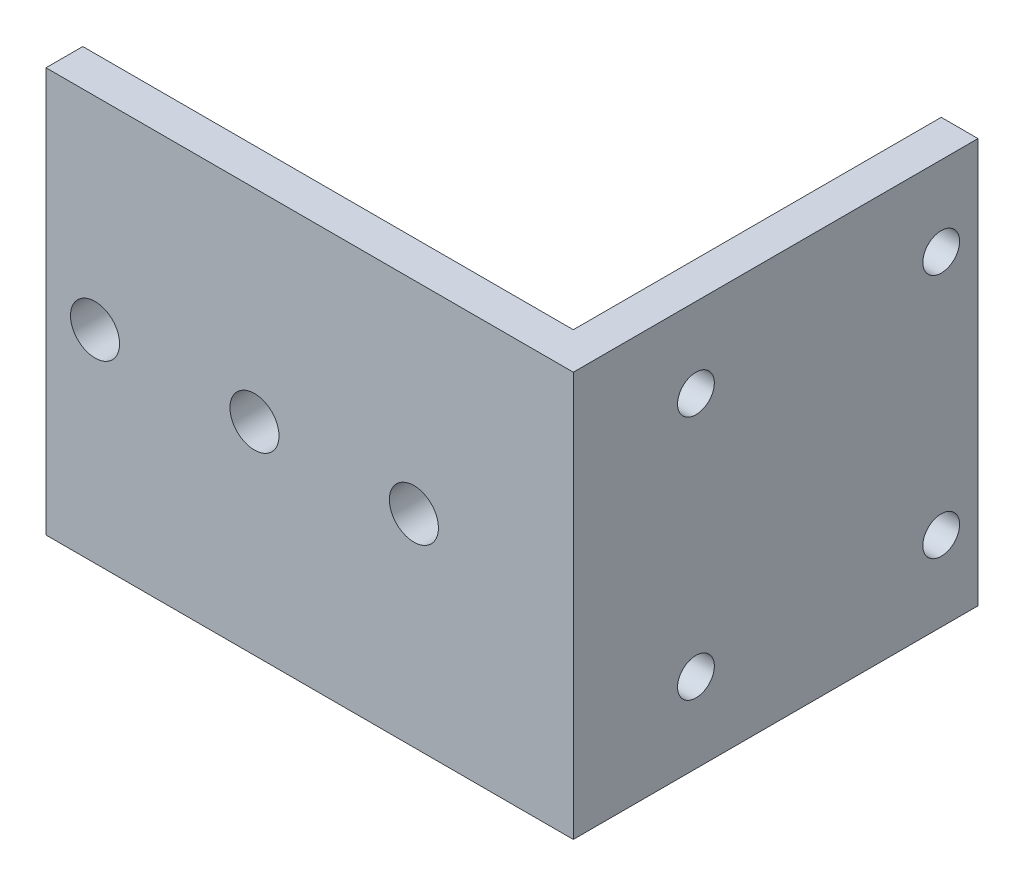
ISO-10303-21;
HEADER;
FILE_DESCRIPTION(('STEP AP214'),'2;1');
FILE_NAME('part.step','',(''),(''),'','','');
FILE_SCHEMA(('AUTOMOTIVE_DESIGN { 1 0 10303 214 1 1 1 1 }'));
ENDSEC;
DATA;
#1=APPLICATION_CONTEXT('core data for automotive mechanical design processes');
#2=APPLICATION_PROTOCOL_DEFINITION('international standard','automotive_design',2000,#1);
#3=PRODUCT_CONTEXT('',#1,'mechanical');
#4=PRODUCT('Part','Part','',(#3));
#5=PRODUCT_RELATED_PRODUCT_CATEGORY('part','',(#4));
#6=PRODUCT_DEFINITION_FORMATION('','',#4);
#7=PRODUCT_DEFINITION_CONTEXT('part definition',#1,'design');
#8=PRODUCT_DEFINITION('design','',#6,#7);
#9=PRODUCT_DEFINITION_SHAPE('','',#8);
#10=(LENGTH_UNIT() NAMED_UNIT(*) SI_UNIT(.MILLI.,.METRE.));
#11=(NAMED_UNIT(*) PLANE_ANGLE_UNIT() SI_UNIT($,.RADIAN.));
#12=(NAMED_UNIT(*) SI_UNIT($,.STERADIAN.) SOLID_ANGLE_UNIT());
#13=UNCERTAINTY_MEASURE_WITH_UNIT(LENGTH_MEASURE(1.E-05),#10,'distance_accuracy_value','');
#14=(GEOMETRIC_REPRESENTATION_CONTEXT(3) GLOBAL_UNCERTAINTY_ASSIGNED_CONTEXT((#13)) GLOBAL_UNIT_ASSIGNED_CONTEXT((#10,
#11,#12)) REPRESENTATION_CONTEXT('',''));
#15=CARTESIAN_POINT('',(0.,0.,0.));
#16=DIRECTION('',(0.,0.,1.));
#17=DIRECTION('',(1.,0.,0.));
#18=AXIS2_PLACEMENT_3D('',#15,#16,#17);
#19=CARTESIAN_POINT('',(0.,33.,-3.));
#20=DIRECTION('',(1.,0.,0.));
#21=DIRECTION('',(0.,0.,-1.));
#22=AXIS2_PLACEMENT_3D('',#19,#20,#21);
#23=PLANE('',#22);
#24=DIRECTION('',(0.,0.,1.));
#25=VECTOR('',#24,1.);
#26=CARTESIAN_POINT('',(0.,0.,-3.));
#27=LINE('',#26,#25);
#28=CARTESIAN_POINT('',(0.,0.,-3.));
#29=VERTEX_POINT('',#28);
#30=CARTESIAN_POINT('',(0.,0.,0.));
#31=VERTEX_POINT('',#30);
#32=EDGE_CURVE('E119',#29,#31,#27,.T.);
#33=ORIENTED_EDGE('',*,*,#32,.T.);
#34=DIRECTION('',(0.,-1.,0.));
#35=VECTOR('',#34,1.);
#36=CARTESIAN_POINT('',(0.,33.,0.));
#37=LINE('',#36,#35);
#38=CARTESIAN_POINT('',(0.,33.,0.));
#39=VERTEX_POINT('',#38);
#40=EDGE_CURVE('E11',#39,#31,#37,.T.);
#41=ORIENTED_EDGE('',*,*,#40,.F.);
#42=DIRECTION('',(0.,0.,1.));
#43=VECTOR('',#42,1.);
#44=CARTESIAN_POINT('',(0.,33.,-3.));
#45=LINE('',#44,#43);
#46=CARTESIAN_POINT('',(0.,33.,-3.));
#47=VERTEX_POINT('',#46);
#48=EDGE_CURVE('E130',#47,#39,#45,.T.);
#49=ORIENTED_EDGE('',*,*,#48,.F.);
#50=DIRECTION('',(0.,-1.,0.));
#51=VECTOR('',#50,1.);
#52=CARTESIAN_POINT('',(0.,33.,-3.));
#53=LINE('',#52,#51);
#54=EDGE_CURVE('E115',#47,#29,#53,.T.);
#55=ORIENTED_EDGE('',*,*,#54,.T.);
#56=EDGE_LOOP('',(#33,#41,#49,#55));
#57=FACE_BOUND('',#56,.T.);
#58=ADVANCED_FACE('F35',(#57),#23,.F.);
#59=CARTESIAN_POINT('',(0.,33.,0.));
#60=DIRECTION('',(0.,0.,-1.));
#61=DIRECTION('',(-1.,0.,0.));
#62=AXIS2_PLACEMENT_3D('',#59,#60,#61);
#63=PLANE('',#62);
#64=CARTESIAN_POINT('',(17.,16.5,0.));
#65=DIRECTION('',(0.,0.,-1.));
#66=DIRECTION('',(-1.,0.,0.));
#67=AXIS2_PLACEMENT_3D('',#64,#65,#66);
#68=CIRCLE('',#67,2.);
#69=CARTESIAN_POINT('',(15.,16.5,0.));
#70=VERTEX_POINT('',#69);
#71=EDGE_CURVE('E282',#70,#70,#68,.F.);
#72=ORIENTED_EDGE('',*,*,#71,.F.);
#73=EDGE_LOOP('',(#72));
#74=FACE_BOUND('',#73,.T.);
#75=CARTESIAN_POINT('',(30.,16.5,0.));
#76=DIRECTION('',(0.,0.,-1.));
#77=DIRECTION('',(-1.,0.,0.));
#78=AXIS2_PLACEMENT_3D('',#75,#76,#77);
#79=CIRCLE('',#78,2.);
#80=CARTESIAN_POINT('',(28.,16.5,0.));
#81=VERTEX_POINT('',#80);
#82=EDGE_CURVE('E286',#81,#81,#79,.F.);
#83=ORIENTED_EDGE('',*,*,#82,.F.);
#84=EDGE_LOOP('',(#83));
#85=FACE_BOUND('',#84,.T.);
#86=CARTESIAN_POINT('',(4.,16.5,0.));
#87=DIRECTION('',(0.,0.,-1.));
#88=DIRECTION('',(-1.,0.,0.));
#89=AXIS2_PLACEMENT_3D('',#86,#87,#88);
#90=CIRCLE('',#89,2.);
#91=CARTESIAN_POINT('',(2.,16.5,0.));
#92=VERTEX_POINT('',#91);
#93=EDGE_CURVE('E295',#92,#92,#90,.F.);
#94=ORIENTED_EDGE('',*,*,#93,.F.);
#95=EDGE_LOOP('',(#94));
#96=FACE_BOUND('',#95,.T.);
#97=DIRECTION('',(1.,0.,0.));
#98=VECTOR('',#97,1.);
#99=CARTESIAN_POINT('',(0.,0.,0.));
#100=LINE('',#99,#98);
#101=CARTESIAN_POINT('',(43.,0.,0.));
#102=VERTEX_POINT('',#101);
#103=EDGE_CURVE('E122',#31,#102,#100,.T.);
#104=ORIENTED_EDGE('',*,*,#103,.T.);
#105=DIRECTION('',(0.,-1.,0.));
#106=VECTOR('',#105,1.);
#107=CARTESIAN_POINT('',(43.,33.,0.));
#108=LINE('',#107,#106);
#109=CARTESIAN_POINT('',(43.,33.,0.));
#110=VERTEX_POINT('',#109);
#111=EDGE_CURVE('E43',#110,#102,#108,.T.);
#112=ORIENTED_EDGE('',*,*,#111,.F.);
#113=DIRECTION('',(1.,0.,0.));
#114=VECTOR('',#113,1.);
#115=CARTESIAN_POINT('',(0.,33.,0.));
#116=LINE('',#115,#114);
#117=EDGE_CURVE('E88',#39,#110,#116,.T.);
#118=ORIENTED_EDGE('',*,*,#117,.F.);
#119=ORIENTED_EDGE('',*,*,#40,.T.);
#120=EDGE_LOOP('',(#104,#112,#118,#119));
#121=FACE_BOUND('',#120,.T.);
#122=ADVANCED_FACE('F158',(#74,#85,#96,#121),#63,.F.);
#123=CARTESIAN_POINT('',(43.,33.,0.));
#124=DIRECTION('',(-1.,0.,0.));
#125=DIRECTION('',(0.,0.,1.));
#126=AXIS2_PLACEMENT_3D('',#123,#124,#125);
#127=PLANE('',#126);
#128=CARTESIAN_POINT('',(43.,26.5,-10.));
#129=DIRECTION('',(-1.,0.,0.));
#130=DIRECTION('',(0.,0.,1.));
#131=AXIS2_PLACEMENT_3D('',#128,#129,#130);
#132=CIRCLE('',#131,1.5);
#133=CARTESIAN_POINT('',(43.,26.5,-8.5));
#134=VERTEX_POINT('',#133);
#135=EDGE_CURVE('E301',#134,#134,#132,.F.);
#136=ORIENTED_EDGE('',*,*,#135,.F.);
#137=EDGE_LOOP('',(#136));
#138=FACE_BOUND('',#137,.T.);
#139=CARTESIAN_POINT('',(43.,6.5,-10.));
#140=DIRECTION('',(-1.,0.,0.));
#141=DIRECTION('',(0.,0.,1.));
#142=AXIS2_PLACEMENT_3D('',#139,#140,#141);
#143=CIRCLE('',#142,1.5);
#144=CARTESIAN_POINT('',(43.,6.5,-8.5));
#145=VERTEX_POINT('',#144);
#146=EDGE_CURVE('E307',#145,#145,#143,.F.);
#147=ORIENTED_EDGE('',*,*,#146,.F.);
#148=EDGE_LOOP('',(#147));
#149=FACE_BOUND('',#148,.T.);
#150=CARTESIAN_POINT('',(43.,26.5,-30.));
#151=DIRECTION('',(-1.,0.,0.));
#152=DIRECTION('',(0.,0.,1.));
#153=AXIS2_PLACEMENT_3D('',#150,#151,#152);
#154=CIRCLE('',#153,1.5);
#155=CARTESIAN_POINT('',(43.,26.5,-28.5));
#156=VERTEX_POINT('',#155);
#157=EDGE_CURVE('E313',#156,#156,#154,.F.);
#158=ORIENTED_EDGE('',*,*,#157,.F.);
#159=EDGE_LOOP('',(#158));
#160=FACE_BOUND('',#159,.T.);
#161=CARTESIAN_POINT('',(43.,6.5,-30.));
#162=DIRECTION('',(-1.,0.,0.));
#163=DIRECTION('',(0.,0.,1.));
#164=AXIS2_PLACEMENT_3D('',#161,#162,#163);
#165=CIRCLE('',#164,1.5);
#166=CARTESIAN_POINT('',(43.,6.5,-28.5));
#167=VERTEX_POINT('',#166);
#168=EDGE_CURVE('E123',#167,#167,#165,.F.);
#169=ORIENTED_EDGE('',*,*,#168,.F.);
#170=EDGE_LOOP('',(#169));
#171=FACE_BOUND('',#170,.T.);
#172=DIRECTION('',(0.,0.,-1.));
#173=VECTOR('',#172,1.);
#174=CARTESIAN_POINT('',(43.,0.,0.));
#175=LINE('',#174,#173);
#176=CARTESIAN_POINT('',(43.,0.,-33.));
#177=VERTEX_POINT('',#176);
#178=EDGE_CURVE('E125',#102,#177,#175,.T.);
#179=ORIENTED_EDGE('',*,*,#178,.T.);
#180=DIRECTION('',(0.,-1.,0.));
#181=VECTOR('',#180,1.);
#182=CARTESIAN_POINT('',(43.,33.,-33.));
#183=LINE('',#182,#181);
#184=CARTESIAN_POINT('',(43.,33.,-33.));
#185=VERTEX_POINT('',#184);
#186=EDGE_CURVE('E110',#185,#177,#183,.T.);
#187=ORIENTED_EDGE('',*,*,#186,.F.);
#188=DIRECTION('',(0.,0.,-1.));
#189=VECTOR('',#188,1.);
#190=CARTESIAN_POINT('',(43.,33.,0.));
#191=LINE('',#190,#189);
#192=EDGE_CURVE('E101',#110,#185,#191,.T.);
#193=ORIENTED_EDGE('',*,*,#192,.F.);
#194=ORIENTED_EDGE('',*,*,#111,.T.);
#195=EDGE_LOOP('',(#179,#187,#193,#194));
#196=FACE_BOUND('',#195,.T.);
#197=ADVANCED_FACE('F136',(#138,#149,#160,#171,#196),#127,.F.);
#198=CARTESIAN_POINT('',(43.,33.,-33.));
#199=DIRECTION('',(0.,0.,1.));
#200=DIRECTION('',(1.,0.,0.));
#201=AXIS2_PLACEMENT_3D('',#198,#199,#200);
#202=PLANE('',#201);
#203=DIRECTION('',(-1.,0.,0.));
#204=VECTOR('',#203,1.);
#205=CARTESIAN_POINT('',(43.,0.,-33.));
#206=LINE('',#205,#204);
#207=CARTESIAN_POINT('',(40.,0.,-33.));
#208=VERTEX_POINT('',#207);
#209=EDGE_CURVE('E109',#177,#208,#206,.T.);
#210=ORIENTED_EDGE('',*,*,#209,.T.);
#211=DIRECTION('',(0.,-1.,0.));
#212=VECTOR('',#211,1.);
#213=CARTESIAN_POINT('',(40.,33.,-33.));
#214=LINE('',#213,#212);
#215=CARTESIAN_POINT('',(40.,33.,-33.));
#216=VERTEX_POINT('',#215);
#217=EDGE_CURVE('E106',#216,#208,#214,.T.);
#218=ORIENTED_EDGE('',*,*,#217,.F.);
#219=DIRECTION('',(-1.,0.,0.));
#220=VECTOR('',#219,1.);
#221=CARTESIAN_POINT('',(43.,33.,-33.));
#222=LINE('',#221,#220);
#223=EDGE_CURVE('E95',#185,#216,#222,.T.);
#224=ORIENTED_EDGE('',*,*,#223,.F.);
#225=ORIENTED_EDGE('',*,*,#186,.T.);
#226=EDGE_LOOP('',(#210,#218,#224,#225));
#227=FACE_BOUND('',#226,.T.);
#228=ADVANCED_FACE('F107',(#227),#202,.F.);
#229=CARTESIAN_POINT('',(40.,33.,-33.));
#230=DIRECTION('',(1.,0.,0.));
#231=DIRECTION('',(0.,0.,-1.));
#232=AXIS2_PLACEMENT_3D('',#229,#230,#231);
#233=PLANE('',#232);
#234=CARTESIAN_POINT('',(40.,26.5,-10.));
#235=DIRECTION('',(-1.,0.,0.));
#236=DIRECTION('',(0.,0.,1.));
#237=AXIS2_PLACEMENT_3D('',#234,#235,#236);
#238=CIRCLE('',#237,1.5);
#239=CARTESIAN_POINT('',(40.,26.5,-8.5));
#240=VERTEX_POINT('',#239);
#241=EDGE_CURVE('E298',#240,#240,#238,.T.);
#242=ORIENTED_EDGE('',*,*,#241,.F.);
#243=EDGE_LOOP('',(#242));
#244=FACE_BOUND('',#243,.T.);
#245=CARTESIAN_POINT('',(40.,6.5,-10.));
#246=DIRECTION('',(-1.,0.,0.));
#247=DIRECTION('',(0.,0.,1.));
#248=AXIS2_PLACEMENT_3D('',#245,#246,#247);
#249=CIRCLE('',#248,1.5);
#250=CARTESIAN_POINT('',(40.,6.5,-8.5));
#251=VERTEX_POINT('',#250);
#252=EDGE_CURVE('E304',#251,#251,#249,.T.);
#253=ORIENTED_EDGE('',*,*,#252,.F.);
#254=EDGE_LOOP('',(#253));
#255=FACE_BOUND('',#254,.T.);
#256=CARTESIAN_POINT('',(40.,26.5,-30.));
#257=DIRECTION('',(-1.,0.,0.));
#258=DIRECTION('',(0.,0.,1.));
#259=AXIS2_PLACEMENT_3D('',#256,#257,#258);
#260=CIRCLE('',#259,1.5);
#261=CARTESIAN_POINT('',(40.,26.5,-28.5));
#262=VERTEX_POINT('',#261);
#263=EDGE_CURVE('E310',#262,#262,#260,.T.);
#264=ORIENTED_EDGE('',*,*,#263,.F.);
#265=EDGE_LOOP('',(#264));
#266=FACE_BOUND('',#265,.T.);
#267=CARTESIAN_POINT('',(40.,6.5,-30.));
#268=DIRECTION('',(-1.,0.,0.));
#269=DIRECTION('',(0.,0.,1.));
#270=AXIS2_PLACEMENT_3D('',#267,#268,#269);
#271=CIRCLE('',#270,1.5);
#272=CARTESIAN_POINT('',(40.,6.5,-28.5));
#273=VERTEX_POINT('',#272);
#274=EDGE_CURVE('E316',#273,#273,#271,.T.);
#275=ORIENTED_EDGE('',*,*,#274,.F.);
#276=EDGE_LOOP('',(#275));
#277=FACE_BOUND('',#276,.T.);
#278=DIRECTION('',(0.,0.,1.));
#279=VECTOR('',#278,1.);
#280=CARTESIAN_POINT('',(40.,0.,-33.));
#281=LINE('',#280,#279);
#282=CARTESIAN_POINT('',(40.,0.,-3.00000000000001));
#283=VERTEX_POINT('',#282);
#284=EDGE_CURVE('E74',#208,#283,#281,.T.);
#285=ORIENTED_EDGE('',*,*,#284,.T.);
#286=DIRECTION('',(0.,-1.,0.));
#287=VECTOR('',#286,1.);
#288=CARTESIAN_POINT('',(40.,33.,-3.00000000000001));
#289=LINE('',#288,#287);
#290=CARTESIAN_POINT('',(40.,33.,-3.00000000000001));
#291=VERTEX_POINT('',#290);
#292=EDGE_CURVE('E111',#291,#283,#289,.T.);
#293=ORIENTED_EDGE('',*,*,#292,.F.);
#294=DIRECTION('',(0.,0.,1.));
#295=VECTOR('',#294,1.);
#296=CARTESIAN_POINT('',(40.,33.,-33.));
#297=LINE('',#296,#295);
#298=EDGE_CURVE('E99',#216,#291,#297,.T.);
#299=ORIENTED_EDGE('',*,*,#298,.F.);
#300=ORIENTED_EDGE('',*,*,#217,.T.);
#301=EDGE_LOOP('',(#285,#293,#299,#300));
#302=FACE_BOUND('',#301,.T.);
#303=ADVANCED_FACE('F113',(#244,#255,#266,#277,#302),#233,.F.);
#304=CARTESIAN_POINT('',(40.,33.,-3.00000000000001));
#305=DIRECTION('',(0.,0.,1.));
#306=DIRECTION('',(1.,0.,0.));
#307=AXIS2_PLACEMENT_3D('',#304,#305,#306);
#308=PLANE('',#307);
#309=CARTESIAN_POINT('',(17.,16.5,-3.));
#310=DIRECTION('',(0.,0.,-1.));
#311=DIRECTION('',(-1.,0.,0.));
#312=AXIS2_PLACEMENT_3D('',#309,#310,#311);
#313=CIRCLE('',#312,2.);
#314=CARTESIAN_POINT('',(15.,16.5,-3.));
#315=VERTEX_POINT('',#314);
#316=EDGE_CURVE('E280',#315,#315,#313,.T.);
#317=ORIENTED_EDGE('',*,*,#316,.F.);
#318=EDGE_LOOP('',(#317));
#319=FACE_BOUND('',#318,.T.);
#320=CARTESIAN_POINT('',(30.,16.5,-3.));
#321=DIRECTION('',(0.,0.,-1.));
#322=DIRECTION('',(-1.,0.,0.));
#323=AXIS2_PLACEMENT_3D('',#320,#321,#322);
#324=CIRCLE('',#323,2.);
#325=CARTESIAN_POINT('',(28.,16.5,-3.));
#326=VERTEX_POINT('',#325);
#327=EDGE_CURVE('E283',#326,#326,#324,.T.);
#328=ORIENTED_EDGE('',*,*,#327,.F.);
#329=EDGE_LOOP('',(#328));
#330=FACE_BOUND('',#329,.T.);
#331=CARTESIAN_POINT('',(4.,16.5,-3.));
#332=DIRECTION('',(0.,0.,-1.));
#333=DIRECTION('',(-1.,0.,0.));
#334=AXIS2_PLACEMENT_3D('',#331,#332,#333);
#335=CIRCLE('',#334,2.);
#336=CARTESIAN_POINT('',(2.,16.5,-3.));
#337=VERTEX_POINT('',#336);
#338=EDGE_CURVE('E292',#337,#337,#335,.T.);
#339=ORIENTED_EDGE('',*,*,#338,.F.);
#340=EDGE_LOOP('',(#339));
#341=FACE_BOUND('',#340,.T.);
#342=DIRECTION('',(-1.,0.,0.));
#343=VECTOR('',#342,1.);
#344=CARTESIAN_POINT('',(40.,0.,-3.00000000000001));
#345=LINE('',#344,#343);
#346=EDGE_CURVE('E80',#283,#29,#345,.T.);
#347=ORIENTED_EDGE('',*,*,#346,.T.);
#348=ORIENTED_EDGE('',*,*,#54,.F.);
#349=DIRECTION('',(-1.,0.,0.));
#350=VECTOR('',#349,1.);
#351=CARTESIAN_POINT('',(40.,33.,-3.00000000000001));
#352=LINE('',#351,#350);
#353=EDGE_CURVE('E51',#291,#47,#352,.T.);
#354=ORIENTED_EDGE('',*,*,#353,.F.);
#355=ORIENTED_EDGE('',*,*,#292,.T.);
#356=EDGE_LOOP('',(#347,#348,#354,#355));
#357=FACE_BOUND('',#356,.T.);
#358=ADVANCED_FACE('F143',(#319,#330,#341,#357),#308,.F.);
#359=CARTESIAN_POINT('',(0.,33.,0.));
#360=DIRECTION('',(0.,1.,0.));
#361=DIRECTION('',(0.,0.,1.));
#362=AXIS2_PLACEMENT_3D('',#359,#360,#361);
#363=PLANE('',#362);
#364=ORIENTED_EDGE('',*,*,#48,.T.);
#365=ORIENTED_EDGE('',*,*,#117,.T.);
#366=ORIENTED_EDGE('',*,*,#192,.T.);
#367=ORIENTED_EDGE('',*,*,#223,.T.);
#368=ORIENTED_EDGE('',*,*,#298,.T.);
#369=ORIENTED_EDGE('',*,*,#353,.T.);
#370=EDGE_LOOP('',(#364,#365,#366,#367,#368,#369));
#371=FACE_BOUND('',#370,.T.);
#372=ADVANCED_FACE('F97',(#371),#363,.T.);
#373=CARTESIAN_POINT('',(0.,0.,0.));
#374=DIRECTION('',(0.,1.,0.));
#375=DIRECTION('',(0.,0.,1.));
#376=AXIS2_PLACEMENT_3D('',#373,#374,#375);
#377=PLANE('',#376);
#378=ORIENTED_EDGE('',*,*,#32,.F.);
#379=ORIENTED_EDGE('',*,*,#346,.F.);
#380=ORIENTED_EDGE('',*,*,#284,.F.);
#381=ORIENTED_EDGE('',*,*,#209,.F.);
#382=ORIENTED_EDGE('',*,*,#178,.F.);
#383=ORIENTED_EDGE('',*,*,#103,.F.);
#384=EDGE_LOOP('',(#378,#379,#380,#381,#382,#383));
#385=FACE_BOUND('',#384,.T.);
#386=ADVANCED_FACE('F139',(#385),#377,.F.);
#387=CARTESIAN_POINT('',(43.001,6.5,-30.));
#388=DIRECTION('',(-1.,0.,0.));
#389=DIRECTION('',(0.,0.,1.));
#390=AXIS2_PLACEMENT_3D('',#387,#388,#389);
#391=CYLINDRICAL_SURFACE('',#390,1.5);
#392=ORIENTED_EDGE('',*,*,#274,.T.);
#393=EDGE_LOOP('',(#392));
#394=FACE_BOUND('',#393,.T.);
#395=ORIENTED_EDGE('',*,*,#168,.T.);
#396=EDGE_LOOP('',(#395));
#397=FACE_BOUND('',#396,.T.);
#398=ADVANCED_FACE('F190',(#394,#397),#391,.F.);
#399=CARTESIAN_POINT('',(43.001,26.5,-30.));
#400=DIRECTION('',(-1.,0.,0.));
#401=DIRECTION('',(0.,0.,1.));
#402=AXIS2_PLACEMENT_3D('',#399,#400,#401);
#403=CYLINDRICAL_SURFACE('',#402,1.5);
#404=ORIENTED_EDGE('',*,*,#263,.T.);
#405=EDGE_LOOP('',(#404));
#406=FACE_BOUND('',#405,.T.);
#407=ORIENTED_EDGE('',*,*,#157,.T.);
#408=EDGE_LOOP('',(#407));
#409=FACE_BOUND('',#408,.T.);
#410=ADVANCED_FACE('F195',(#406,#409),#403,.F.);
#411=CARTESIAN_POINT('',(43.001,6.5,-10.));
#412=DIRECTION('',(-1.,0.,0.));
#413=DIRECTION('',(0.,0.,1.));
#414=AXIS2_PLACEMENT_3D('',#411,#412,#413);
#415=CYLINDRICAL_SURFACE('',#414,1.5);
#416=ORIENTED_EDGE('',*,*,#252,.T.);
#417=EDGE_LOOP('',(#416));
#418=FACE_BOUND('',#417,.T.);
#419=ORIENTED_EDGE('',*,*,#146,.T.);
#420=EDGE_LOOP('',(#419));
#421=FACE_BOUND('',#420,.T.);
#422=ADVANCED_FACE('F207',(#418,#421),#415,.F.);
#423=CARTESIAN_POINT('',(43.001,26.5,-10.));
#424=DIRECTION('',(-1.,0.,0.));
#425=DIRECTION('',(0.,0.,1.));
#426=AXIS2_PLACEMENT_3D('',#423,#424,#425);
#427=CYLINDRICAL_SURFACE('',#426,1.5);
#428=ORIENTED_EDGE('',*,*,#241,.T.);
#429=EDGE_LOOP('',(#428));
#430=FACE_BOUND('',#429,.T.);
#431=ORIENTED_EDGE('',*,*,#135,.T.);
#432=EDGE_LOOP('',(#431));
#433=FACE_BOUND('',#432,.T.);
#434=ADVANCED_FACE('F217',(#430,#433),#427,.F.);
#435=CARTESIAN_POINT('',(4.,16.5,0.0010000000000049));
#436=DIRECTION('',(0.,0.,-1.));
#437=DIRECTION('',(-1.,0.,0.));
#438=AXIS2_PLACEMENT_3D('',#435,#436,#437);
#439=CYLINDRICAL_SURFACE('',#438,2.);
#440=ORIENTED_EDGE('',*,*,#338,.T.);
#441=EDGE_LOOP('',(#440));
#442=FACE_BOUND('',#441,.T.);
#443=ORIENTED_EDGE('',*,*,#93,.T.);
#444=EDGE_LOOP('',(#443));
#445=FACE_BOUND('',#444,.T.);
#446=ADVANCED_FACE('F226',(#442,#445),#439,.F.);
#447=CARTESIAN_POINT('',(30.,16.5,0.00100000000000143));
#448=DIRECTION('',(0.,0.,-1.));
#449=DIRECTION('',(-1.,0.,0.));
#450=AXIS2_PLACEMENT_3D('',#447,#448,#449);
#451=CYLINDRICAL_SURFACE('',#450,2.);
#452=ORIENTED_EDGE('',*,*,#327,.T.);
#453=EDGE_LOOP('',(#452));
#454=FACE_BOUND('',#453,.T.);
#455=ORIENTED_EDGE('',*,*,#82,.T.);
#456=EDGE_LOOP('',(#455));
#457=FACE_BOUND('',#456,.T.);
#458=ADVANCED_FACE('F246',(#454,#457),#451,.F.);
#459=CARTESIAN_POINT('',(17.,16.5,0.00100000000000317));
#460=DIRECTION('',(0.,0.,-1.));
#461=DIRECTION('',(-1.,0.,0.));
#462=AXIS2_PLACEMENT_3D('',#459,#460,#461);
#463=CYLINDRICAL_SURFACE('',#462,2.);
#464=ORIENTED_EDGE('',*,*,#316,.T.);
#465=EDGE_LOOP('',(#464));
#466=FACE_BOUND('',#465,.T.);
#467=ORIENTED_EDGE('',*,*,#71,.T.);
#468=EDGE_LOOP('',(#467));
#469=FACE_BOUND('',#468,.T.);
#470=ADVANCED_FACE('F256',(#466,#469),#463,.F.);
#471=CLOSED_SHELL('',(#58,#122,#197,#228,#303,#358,#372,#386,#398,#410,#422,#434,#446,#458,#470));
#472=MANIFOLD_SOLID_BREP('B2',#471);
#473=ADVANCED_BREP_SHAPE_REPRESENTATION('',(#18,#472),#14);
#474=SHAPE_DEFINITION_REPRESENTATION(#9,#473);
ENDSEC;
END-ISO-10303-21;
